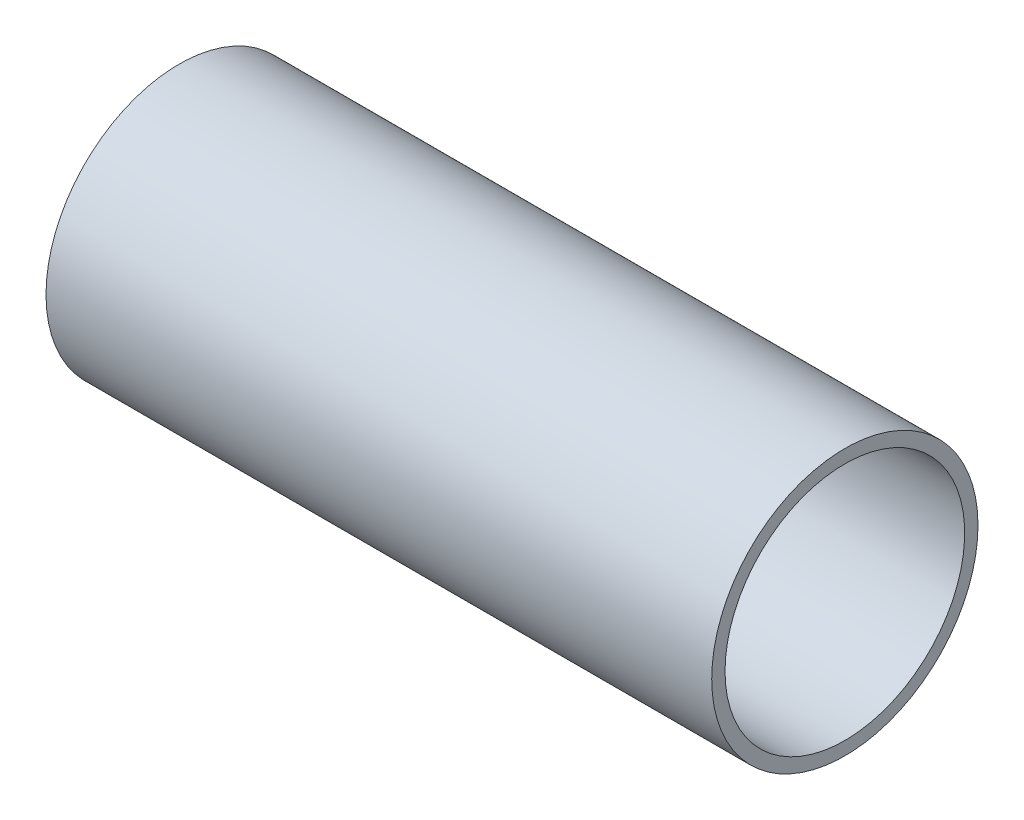
ISO-10303-21;
HEADER;
FILE_DESCRIPTION(('STEP AP214'),'2;1');
FILE_NAME('part.step','',(''),(''),'','','');
FILE_SCHEMA(('AUTOMOTIVE_DESIGN { 1 0 10303 214 1 1 1 1 }'));
ENDSEC;
DATA;
#1=APPLICATION_CONTEXT('core data for automotive mechanical design processes');
#2=APPLICATION_PROTOCOL_DEFINITION('international standard','automotive_design',2000,#1);
#3=PRODUCT_CONTEXT('',#1,'mechanical');
#4=PRODUCT('Part','Part','',(#3));
#5=PRODUCT_RELATED_PRODUCT_CATEGORY('part','',(#4));
#6=PRODUCT_DEFINITION_FORMATION('','',#4);
#7=PRODUCT_DEFINITION_CONTEXT('part definition',#1,'design');
#8=PRODUCT_DEFINITION('design','',#6,#7);
#9=PRODUCT_DEFINITION_SHAPE('','',#8);
#10=(LENGTH_UNIT() NAMED_UNIT(*) SI_UNIT(.MILLI.,.METRE.));
#11=(NAMED_UNIT(*) PLANE_ANGLE_UNIT() SI_UNIT($,.RADIAN.));
#12=(NAMED_UNIT(*) SI_UNIT($,.STERADIAN.) SOLID_ANGLE_UNIT());
#13=UNCERTAINTY_MEASURE_WITH_UNIT(LENGTH_MEASURE(1.E-05),#10,'distance_accuracy_value','');
#14=(GEOMETRIC_REPRESENTATION_CONTEXT(3) GLOBAL_UNCERTAINTY_ASSIGNED_CONTEXT((#13)) GLOBAL_UNIT_ASSIGNED_CONTEXT((#10,
#11,#12)) REPRESENTATION_CONTEXT('',''));
#15=CARTESIAN_POINT('',(0.,0.,0.));
#16=DIRECTION('',(0.,0.,1.));
#17=DIRECTION('',(1.,0.,0.));
#18=AXIS2_PLACEMENT_3D('',#15,#16,#17);
#19=CARTESIAN_POINT('',(635.,0.,0.));
#20=DIRECTION('',(1.,0.,0.));
#21=DIRECTION('',(0.,0.,-1.));
#22=AXIS2_PLACEMENT_3D('',#19,#20,#21);
#23=PLANE('',#22);
#24=CARTESIAN_POINT('',(635.,0.,0.));
#25=DIRECTION('',(1.,0.,0.));
#26=DIRECTION('',(0.,0.,-1.));
#27=AXIS2_PLACEMENT_3D('',#24,#25,#26);
#28=CIRCLE('',#27,254.);
#29=CARTESIAN_POINT('',(635.,0.,254.));
#30=VERTEX_POINT('',#29);
#31=EDGE_CURVE('E10',#30,#30,#28,.T.);
#32=ORIENTED_EDGE('',*,*,#31,.T.);
#33=EDGE_LOOP('',(#32));
#34=FACE_BOUND('',#33,.T.);
#35=CARTESIAN_POINT('',(635.,0.,0.));
#36=DIRECTION('',(1.,0.,0.));
#37=DIRECTION('',(0.,0.,-1.));
#38=AXIS2_PLACEMENT_3D('',#35,#36,#37);
#39=CIRCLE('',#38,228.6);
#40=CARTESIAN_POINT('',(635.,0.,228.6));
#41=VERTEX_POINT('',#40);
#42=EDGE_CURVE('E41',#41,#41,#39,.T.);
#43=ORIENTED_EDGE('',*,*,#42,.F.);
#44=EDGE_LOOP('',(#43));
#45=FACE_BOUND('',#44,.T.);
#46=ADVANCED_FACE('F30',(#34,#45),#23,.T.);
#47=CARTESIAN_POINT('',(-635.,0.,0.));
#48=DIRECTION('',(1.,0.,0.));
#49=DIRECTION('',(0.,0.,-1.));
#50=AXIS2_PLACEMENT_3D('',#47,#48,#49);
#51=PLANE('',#50);
#52=CARTESIAN_POINT('',(-635.,0.,0.));
#53=DIRECTION('',(1.,0.,0.));
#54=DIRECTION('',(0.,0.,-1.));
#55=AXIS2_PLACEMENT_3D('',#52,#53,#54);
#56=CIRCLE('',#55,254.);
#57=CARTESIAN_POINT('',(-635.,0.,254.));
#58=VERTEX_POINT('',#57);
#59=EDGE_CURVE('E34',#58,#58,#56,.T.);
#60=ORIENTED_EDGE('',*,*,#59,.F.);
#61=EDGE_LOOP('',(#60));
#62=FACE_BOUND('',#61,.T.);
#63=CARTESIAN_POINT('',(-635.,0.,0.));
#64=DIRECTION('',(1.,0.,0.));
#65=DIRECTION('',(0.,0.,-1.));
#66=AXIS2_PLACEMENT_3D('',#63,#64,#65);
#67=CIRCLE('',#66,228.6);
#68=CARTESIAN_POINT('',(-635.,0.,228.6));
#69=VERTEX_POINT('',#68);
#70=EDGE_CURVE('E43',#69,#69,#67,.T.);
#71=ORIENTED_EDGE('',*,*,#70,.T.);
#72=EDGE_LOOP('',(#71));
#73=FACE_BOUND('',#72,.T.);
#74=ADVANCED_FACE('F53',(#62,#73),#51,.F.);
#75=CARTESIAN_POINT('',(635.,0.,0.));
#76=DIRECTION('',(-1.,0.,0.));
#77=DIRECTION('',(0.,0.,1.));
#78=AXIS2_PLACEMENT_3D('',#75,#76,#77);
#79=CYLINDRICAL_SURFACE('',#78,254.);
#80=CARTESIAN_POINT('',(635.,0.,254.));
#81=CARTESIAN_POINT('',(621.770833333333,0.,254.));
#82=CARTESIAN_POINT('',(608.541666666667,0.,254.));
#83=CARTESIAN_POINT('',(582.083333333333,0.,254.));
#84=CARTESIAN_POINT('',(568.854166666667,0.,254.));
#85=CARTESIAN_POINT('',(542.395833333333,0.,254.));
#86=CARTESIAN_POINT('',(529.166666666667,0.,254.));
#87=CARTESIAN_POINT('',(502.708333333333,0.,254.));
#88=CARTESIAN_POINT('',(489.479166666667,0.,254.));
#89=CARTESIAN_POINT('',(463.020833333333,0.,254.));
#90=CARTESIAN_POINT('',(449.791666666667,0.,254.));
#91=CARTESIAN_POINT('',(423.333333333333,0.,254.));
#92=CARTESIAN_POINT('',(410.104166666667,0.,254.));
#93=CARTESIAN_POINT('',(383.645833333333,0.,254.));
#94=CARTESIAN_POINT('',(370.416666666667,0.,254.));
#95=CARTESIAN_POINT('',(343.958333333333,0.,254.));
#96=CARTESIAN_POINT('',(330.729166666667,0.,254.));
#97=CARTESIAN_POINT('',(304.270833333333,0.,254.));
#98=CARTESIAN_POINT('',(291.041666666667,0.,254.));
#99=CARTESIAN_POINT('',(264.583333333333,0.,254.));
#100=CARTESIAN_POINT('',(251.354166666667,0.,254.));
#101=CARTESIAN_POINT('',(224.895833333333,0.,254.));
#102=CARTESIAN_POINT('',(211.666666666667,0.,254.));
#103=CARTESIAN_POINT('',(185.208333333333,0.,254.));
#104=CARTESIAN_POINT('',(171.979166666666,0.,254.));
#105=CARTESIAN_POINT('',(145.520833333333,0.,254.));
#106=CARTESIAN_POINT('',(132.291666666667,0.,254.));
#107=CARTESIAN_POINT('',(105.833333333333,0.,254.));
#108=CARTESIAN_POINT('',(92.6041666666664,0.,254.));
#109=CARTESIAN_POINT('',(66.1458333333331,0.,254.));
#110=CARTESIAN_POINT('',(52.9166666666664,0.,254.));
#111=CARTESIAN_POINT('',(26.4583333333331,0.,254.));
#112=CARTESIAN_POINT('',(13.2291666666664,0.,254.));
#113=CARTESIAN_POINT('',(-13.2291666666669,0.,254.));
#114=CARTESIAN_POINT('',(-26.4583333333335,0.,254.));
#115=CARTESIAN_POINT('',(-52.9166666666669,0.,254.));
#116=CARTESIAN_POINT('',(-66.1458333333335,0.,254.));
#117=CARTESIAN_POINT('',(-92.6041666666669,0.,254.));
#118=CARTESIAN_POINT('',(-105.833333333334,0.,254.));
#119=CARTESIAN_POINT('',(-132.291666666667,0.,254.));
#120=CARTESIAN_POINT('',(-145.520833333334,0.,254.));
#121=CARTESIAN_POINT('',(-171.979166666667,0.,254.));
#122=CARTESIAN_POINT('',(-185.208333333334,0.,254.));
#123=CARTESIAN_POINT('',(-211.666666666667,0.,254.));
#124=CARTESIAN_POINT('',(-224.895833333334,0.,254.));
#125=CARTESIAN_POINT('',(-251.354166666667,0.,254.));
#126=CARTESIAN_POINT('',(-264.583333333334,0.,254.));
#127=CARTESIAN_POINT('',(-291.041666666667,0.,254.));
#128=CARTESIAN_POINT('',(-304.270833333334,0.,254.));
#129=CARTESIAN_POINT('',(-330.729166666667,0.,254.));
#130=CARTESIAN_POINT('',(-343.958333333334,0.,254.));
#131=CARTESIAN_POINT('',(-370.416666666667,0.,254.));
#132=CARTESIAN_POINT('',(-383.645833333334,0.,254.));
#133=CARTESIAN_POINT('',(-410.104166666667,0.,254.));
#134=CARTESIAN_POINT('',(-423.333333333333,0.,254.));
#135=CARTESIAN_POINT('',(-449.791666666667,0.,254.));
#136=CARTESIAN_POINT('',(-463.020833333334,0.,254.));
#137=CARTESIAN_POINT('',(-489.479166666667,0.,254.));
#138=CARTESIAN_POINT('',(-502.708333333334,0.,254.));
#139=CARTESIAN_POINT('',(-529.166666666667,0.,254.));
#140=CARTESIAN_POINT('',(-542.395833333333,0.,254.));
#141=CARTESIAN_POINT('',(-568.854166666667,0.,254.));
#142=CARTESIAN_POINT('',(-582.083333333333,0.,254.));
#143=CARTESIAN_POINT('',(-608.541666666667,0.,254.));
#144=CARTESIAN_POINT('',(-621.770833333333,0.,254.));
#145=CARTESIAN_POINT('',(-635.,0.,254.));
#146=B_SPLINE_CURVE_WITH_KNOTS('',3,(#80,#81,#82,#83,#84,#85,#86,#87,#88,#89,#90,#91,#92,#93,
#94,#95,#96,#97,#98,#99,#100,#101,#102,#103,#104,#105,#106,#107,#108,#109,#110,#111,#112,#113,
#114,#115,#116,#117,#118,#119,#120,#121,#122,#123,#124,#125,#126,#127,#128,#129,#130,#131,#132,
#133,#134,#135,#136,#137,#138,#139,#140,#141,#142,#143,#144,#145),.UNSPECIFIED.,.F.,.F.,(4,2,2,
2,2,2,2,2,2,2,2,2,2,2,2,2,2,2,2,2,2,2,2,2,2,2,2,2,2,2,2,2,4),(0.,39.6875,79.375,119.0625,158.75,
198.4375,238.125,277.8125,317.5,357.1875,396.875,436.5625,476.25,515.9375,555.625,595.3125,635.,
674.6875,714.375,754.0625,793.75,833.4375,873.125,912.8125,952.5,992.1875,1031.875,1071.5625,
1111.25,1150.9375,1190.625,1230.3125,1270.),.UNSPECIFIED.);
#147=EDGE_CURVE('BSEAM32',#30,#58,#146,.T.);
#148=ORIENTED_EDGE('',*,*,#31,.F.);
#149=ORIENTED_EDGE('',*,*,#59,.T.);
#150=ORIENTED_EDGE('',*,*,#147,.T.);
#151=ORIENTED_EDGE('',*,*,#147,.F.);
#152=EDGE_LOOP('',(#148,#150,#149,#151));
#153=FACE_BOUND('',#152,.T.);
#154=ADVANCED_FACE('F32',(#153),#79,.T.);
#155=CARTESIAN_POINT('',(635.,0.,0.));
#156=DIRECTION('',(-1.,0.,0.));
#157=DIRECTION('',(0.,0.,1.));
#158=AXIS2_PLACEMENT_3D('',#155,#156,#157);
#159=CYLINDRICAL_SURFACE('',#158,228.6);
#160=CARTESIAN_POINT('',(635.,0.,228.6));
#161=CARTESIAN_POINT('',(621.770833333333,0.,228.6));
#162=CARTESIAN_POINT('',(608.541666666667,0.,228.6));
#163=CARTESIAN_POINT('',(582.083333333333,0.,228.6));
#164=CARTESIAN_POINT('',(568.854166666667,0.,228.6));
#165=CARTESIAN_POINT('',(542.395833333333,0.,228.6));
#166=CARTESIAN_POINT('',(529.166666666667,0.,228.6));
#167=CARTESIAN_POINT('',(502.708333333333,0.,228.6));
#168=CARTESIAN_POINT('',(489.479166666667,0.,228.6));
#169=CARTESIAN_POINT('',(463.020833333333,0.,228.6));
#170=CARTESIAN_POINT('',(449.791666666667,0.,228.6));
#171=CARTESIAN_POINT('',(423.333333333333,0.,228.6));
#172=CARTESIAN_POINT('',(410.104166666667,0.,228.6));
#173=CARTESIAN_POINT('',(383.645833333333,0.,228.6));
#174=CARTESIAN_POINT('',(370.416666666667,0.,228.6));
#175=CARTESIAN_POINT('',(343.958333333333,0.,228.6));
#176=CARTESIAN_POINT('',(330.729166666667,0.,228.6));
#177=CARTESIAN_POINT('',(304.270833333333,0.,228.6));
#178=CARTESIAN_POINT('',(291.041666666667,0.,228.6));
#179=CARTESIAN_POINT('',(264.583333333333,0.,228.6));
#180=CARTESIAN_POINT('',(251.354166666667,0.,228.6));
#181=CARTESIAN_POINT('',(224.895833333333,0.,228.6));
#182=CARTESIAN_POINT('',(211.666666666667,0.,228.6));
#183=CARTESIAN_POINT('',(185.208333333333,0.,228.6));
#184=CARTESIAN_POINT('',(171.979166666666,0.,228.6));
#185=CARTESIAN_POINT('',(145.520833333333,0.,228.6));
#186=CARTESIAN_POINT('',(132.291666666667,0.,228.6));
#187=CARTESIAN_POINT('',(105.833333333333,0.,228.6));
#188=CARTESIAN_POINT('',(92.6041666666664,0.,228.6));
#189=CARTESIAN_POINT('',(66.1458333333331,0.,228.6));
#190=CARTESIAN_POINT('',(52.9166666666664,0.,228.6));
#191=CARTESIAN_POINT('',(26.4583333333331,0.,228.6));
#192=CARTESIAN_POINT('',(13.2291666666664,0.,228.6));
#193=CARTESIAN_POINT('',(-13.2291666666669,0.,228.6));
#194=CARTESIAN_POINT('',(-26.4583333333335,0.,228.6));
#195=CARTESIAN_POINT('',(-52.9166666666669,0.,228.6));
#196=CARTESIAN_POINT('',(-66.1458333333335,0.,228.6));
#197=CARTESIAN_POINT('',(-92.6041666666669,0.,228.6));
#198=CARTESIAN_POINT('',(-105.833333333334,0.,228.6));
#199=CARTESIAN_POINT('',(-132.291666666667,0.,228.6));
#200=CARTESIAN_POINT('',(-145.520833333334,0.,228.6));
#201=CARTESIAN_POINT('',(-171.979166666667,0.,228.6));
#202=CARTESIAN_POINT('',(-185.208333333334,0.,228.6));
#203=CARTESIAN_POINT('',(-211.666666666667,0.,228.6));
#204=CARTESIAN_POINT('',(-224.895833333334,0.,228.6));
#205=CARTESIAN_POINT('',(-251.354166666667,0.,228.6));
#206=CARTESIAN_POINT('',(-264.583333333334,0.,228.6));
#207=CARTESIAN_POINT('',(-291.041666666667,0.,228.6));
#208=CARTESIAN_POINT('',(-304.270833333334,0.,228.6));
#209=CARTESIAN_POINT('',(-330.729166666667,0.,228.6));
#210=CARTESIAN_POINT('',(-343.958333333334,0.,228.6));
#211=CARTESIAN_POINT('',(-370.416666666667,0.,228.6));
#212=CARTESIAN_POINT('',(-383.645833333334,0.,228.6));
#213=CARTESIAN_POINT('',(-410.104166666667,0.,228.6));
#214=CARTESIAN_POINT('',(-423.333333333333,0.,228.6));
#215=CARTESIAN_POINT('',(-449.791666666667,0.,228.6));
#216=CARTESIAN_POINT('',(-463.020833333334,0.,228.6));
#217=CARTESIAN_POINT('',(-489.479166666667,0.,228.6));
#218=CARTESIAN_POINT('',(-502.708333333334,0.,228.6));
#219=CARTESIAN_POINT('',(-529.166666666667,0.,228.6));
#220=CARTESIAN_POINT('',(-542.395833333333,0.,228.6));
#221=CARTESIAN_POINT('',(-568.854166666667,0.,228.6));
#222=CARTESIAN_POINT('',(-582.083333333333,0.,228.6));
#223=CARTESIAN_POINT('',(-608.541666666667,0.,228.6));
#224=CARTESIAN_POINT('',(-621.770833333333,0.,228.6));
#225=CARTESIAN_POINT('',(-635.,0.,228.6));
#226=B_SPLINE_CURVE_WITH_KNOTS('',3,(#160,#161,#162,#163,#164,#165,#166,#167,#168,#169,#170,
#171,#172,#173,#174,#175,#176,#177,#178,#179,#180,#181,#182,#183,#184,#185,#186,#187,#188,#189,
#190,#191,#192,#193,#194,#195,#196,#197,#198,#199,#200,#201,#202,#203,#204,#205,#206,#207,#208,
#209,#210,#211,#212,#213,#214,#215,#216,#217,#218,#219,#220,#221,#222,#223,#224,#225),
.UNSPECIFIED.,.F.,.F.,(4,2,2,2,2,2,2,2,2,2,2,2,2,2,2,2,2,2,2,2,2,2,2,2,2,2,2,2,2,2,2,2,4),(0.,
39.6875,79.375,119.0625,158.75,198.4375,238.125,277.8125,317.5,357.1875,396.875,436.5625,476.25,
515.9375,555.625,595.3125,635.,674.6875,714.375,754.0625,793.75,833.4375,873.125,912.8125,952.5,
992.1875,1031.875,1071.5625,1111.25,1150.9375,1190.625,1230.3125,1270.),.UNSPECIFIED.);
#227=EDGE_CURVE('BSEAM49',#41,#69,#226,.T.);
#228=ORIENTED_EDGE('',*,*,#42,.T.);
#229=ORIENTED_EDGE('',*,*,#70,.F.);
#230=ORIENTED_EDGE('',*,*,#227,.T.);
#231=ORIENTED_EDGE('',*,*,#227,.F.);
#232=EDGE_LOOP('',(#228,#230,#229,#231));
#233=FACE_BOUND('',#232,.T.);
#234=ADVANCED_FACE('F49',(#233),#159,.F.);
#235=CLOSED_SHELL('',(#46,#74,#154,#234));
#236=MANIFOLD_SOLID_BREP('B2',#235);
#237=ADVANCED_BREP_SHAPE_REPRESENTATION('',(#18,#236),#14);
#238=SHAPE_DEFINITION_REPRESENTATION(#9,#237);
ENDSEC;
END-ISO-10303-21;
